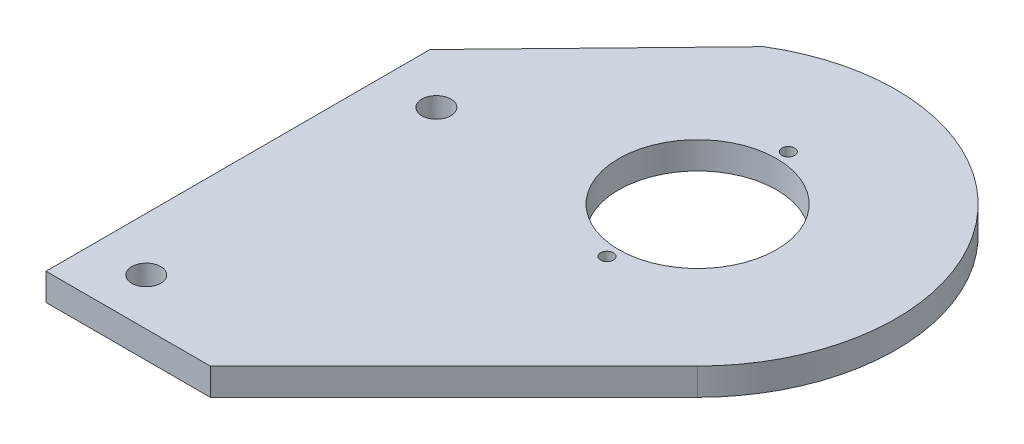
ISO-10303-21;
HEADER;
FILE_DESCRIPTION(('STEP AP214'),'2;1');
FILE_NAME('part.step','',(''),(''),'','','');
FILE_SCHEMA(('AUTOMOTIVE_DESIGN { 1 0 10303 214 1 1 1 1 }'));
ENDSEC;
DATA;
#1=APPLICATION_CONTEXT('core data for automotive mechanical design processes');
#2=APPLICATION_PROTOCOL_DEFINITION('international standard','automotive_design',2000,#1);
#3=PRODUCT_CONTEXT('',#1,'mechanical');
#4=PRODUCT('Part','Part','',(#3));
#5=PRODUCT_RELATED_PRODUCT_CATEGORY('part','',(#4));
#6=PRODUCT_DEFINITION_FORMATION('','',#4);
#7=PRODUCT_DEFINITION_CONTEXT('part definition',#1,'design');
#8=PRODUCT_DEFINITION('design','',#6,#7);
#9=PRODUCT_DEFINITION_SHAPE('','',#8);
#10=(LENGTH_UNIT() NAMED_UNIT(*) SI_UNIT(.MILLI.,.METRE.));
#11=(NAMED_UNIT(*) PLANE_ANGLE_UNIT() SI_UNIT($,.RADIAN.));
#12=(NAMED_UNIT(*) SI_UNIT($,.STERADIAN.) SOLID_ANGLE_UNIT());
#13=UNCERTAINTY_MEASURE_WITH_UNIT(LENGTH_MEASURE(1.E-05),#10,'distance_accuracy_value','');
#14=(GEOMETRIC_REPRESENTATION_CONTEXT(3) GLOBAL_UNCERTAINTY_ASSIGNED_CONTEXT((#13)) GLOBAL_UNIT_ASSIGNED_CONTEXT((#10,
#11,#12)) REPRESENTATION_CONTEXT('',''));
#15=CARTESIAN_POINT('',(0.,0.,0.));
#16=DIRECTION('',(0.,0.,1.));
#17=DIRECTION('',(1.,0.,0.));
#18=AXIS2_PLACEMENT_3D('',#15,#16,#17);
#19=CARTESIAN_POINT('',(0.,-6.35,0.));
#20=DIRECTION('',(-1.,0.,0.));
#21=DIRECTION('',(0.,0.,1.));
#22=AXIS2_PLACEMENT_3D('',#19,#20,#21);
#23=PLANE('',#22);
#24=DIRECTION('',(0.,0.,1.));
#25=VECTOR('',#24,1.);
#26=CARTESIAN_POINT('',(0.,0.,0.));
#27=LINE('',#26,#25);
#28=CARTESIAN_POINT('',(0.,0.,-90.));
#29=VERTEX_POINT('',#28);
#30=CARTESIAN_POINT('',(0.,0.,0.));
#31=VERTEX_POINT('',#30);
#32=EDGE_CURVE('E118',#29,#31,#27,.T.);
#33=ORIENTED_EDGE('',*,*,#32,.F.);
#34=DIRECTION('',(0.,1.,0.));
#35=VECTOR('',#34,1.);
#36=CARTESIAN_POINT('',(0.,-6.35,-90.));
#37=LINE('',#36,#35);
#38=CARTESIAN_POINT('',(0.,-6.35,-90.));
#39=VERTEX_POINT('',#38);
#40=EDGE_CURVE('E11',#39,#29,#37,.T.);
#41=ORIENTED_EDGE('',*,*,#40,.F.);
#42=DIRECTION('',(0.,0.,1.));
#43=VECTOR('',#42,1.);
#44=CARTESIAN_POINT('',(0.,-6.35,0.));
#45=LINE('',#44,#43);
#46=CARTESIAN_POINT('',(0.,-6.35,0.));
#47=VERTEX_POINT('',#46);
#48=EDGE_CURVE('E113',#39,#47,#45,.T.);
#49=ORIENTED_EDGE('',*,*,#48,.T.);
#50=DIRECTION('',(0.,1.,0.));
#51=VECTOR('',#50,1.);
#52=CARTESIAN_POINT('',(0.,-6.35,0.));
#53=LINE('',#52,#51);
#54=EDGE_CURVE('E44',#47,#31,#53,.T.);
#55=ORIENTED_EDGE('',*,*,#54,.T.);
#56=EDGE_LOOP('',(#33,#41,#49,#55));
#57=FACE_BOUND('',#56,.T.);
#58=ADVANCED_FACE('F41',(#57),#23,.T.);
#59=CARTESIAN_POINT('',(0.,-6.35,-90.));
#60=DIRECTION('',(-0.717622638837594,0.,-0.69643215622756));
#61=DIRECTION('',(-0.69643215622756,0.,0.717622638837594));
#62=AXIS2_PLACEMENT_3D('',#59,#60,#61);
#63=PLANE('',#62);
#64=DIRECTION('',(-0.69643215622756,0.,0.717622638837594));
#65=VECTOR('',#64,1.);
#66=CARTESIAN_POINT('',(0.,0.,-90.));
#67=LINE('',#66,#65);
#68=CARTESIAN_POINT('',(38.5109306503488,0.,-129.682710555893));
#69=VERTEX_POINT('',#68);
#70=EDGE_CURVE('E128',#69,#29,#67,.T.);
#71=ORIENTED_EDGE('',*,*,#70,.F.);
#72=DIRECTION('',(0.,1.,0.));
#73=VECTOR('',#72,1.);
#74=CARTESIAN_POINT('',(38.5109306503488,-6.35,-129.682710555893));
#75=LINE('',#74,#73);
#76=CARTESIAN_POINT('',(38.5109306503488,-6.35,-129.682710555893));
#77=VERTEX_POINT('',#76);
#78=EDGE_CURVE('E50',#77,#69,#75,.T.);
#79=ORIENTED_EDGE('',*,*,#78,.F.);
#80=DIRECTION('',(-0.69643215622756,0.,0.717622638837594));
#81=VECTOR('',#80,1.);
#82=CARTESIAN_POINT('',(0.,-6.35,-90.));
#83=LINE('',#82,#81);
#84=EDGE_CURVE('E108',#77,#39,#83,.T.);
#85=ORIENTED_EDGE('',*,*,#84,.T.);
#86=ORIENTED_EDGE('',*,*,#40,.T.);
#87=EDGE_LOOP('',(#71,#79,#85,#86));
#88=FACE_BOUND('',#87,.T.);
#89=ADVANCED_FACE('F134',(#88),#63,.T.);
#90=CARTESIAN_POINT('',(62.75,-6.35,-90.));
#91=DIRECTION('',(0.,1.,0.));
#92=DIRECTION('',(0.,0.,1.));
#93=AXIS2_PLACEMENT_3D('',#90,#91,#92);
#94=CYLINDRICAL_SURFACE('',#93,46.5);
#95=CARTESIAN_POINT('',(62.75,0.,-90.));
#96=DIRECTION('',(0.,1.,0.));
#97=DIRECTION('',(0.,0.,-1.));
#98=AXIS2_PLACEMENT_3D('',#95,#96,#97);
#99=CIRCLE('',#98,46.5);
#100=CARTESIAN_POINT('',(95.6304653251744,0.,-57.1195346748255));
#101=VERTEX_POINT('',#100);
#102=EDGE_CURVE('E97',#101,#69,#99,.T.);
#103=ORIENTED_EDGE('',*,*,#102,.F.);
#104=DIRECTION('',(0.,1.,0.));
#105=VECTOR('',#104,1.);
#106=CARTESIAN_POINT('',(95.6304653251744,-6.35,-57.1195346748255));
#107=LINE('',#106,#105);
#108=CARTESIAN_POINT('',(95.6304653251744,-6.35,-57.1195346748255));
#109=VERTEX_POINT('',#108);
#110=EDGE_CURVE('E92',#109,#101,#107,.T.);
#111=ORIENTED_EDGE('',*,*,#110,.F.);
#112=CARTESIAN_POINT('',(62.75,-6.35,-90.));
#113=DIRECTION('',(0.,1.,0.));
#114=DIRECTION('',(0.,0.,-1.));
#115=AXIS2_PLACEMENT_3D('',#112,#113,#114);
#116=CIRCLE('',#115,46.5);
#117=EDGE_CURVE('E95',#109,#77,#116,.T.);
#118=ORIENTED_EDGE('',*,*,#117,.T.);
#119=ORIENTED_EDGE('',*,*,#78,.T.);
#120=EDGE_LOOP('',(#103,#111,#118,#119));
#121=FACE_BOUND('',#120,.T.);
#122=ADVANCED_FACE('F94',(#121),#94,.T.);
#123=CARTESIAN_POINT('',(95.6304653251744,-6.35,-57.1195346748255));
#124=DIRECTION('',(0.707106781186547,0.,0.707106781186548));
#125=DIRECTION('',(0.707106781186548,0.,-0.707106781186547));
#126=AXIS2_PLACEMENT_3D('',#123,#124,#125);
#127=PLANE('',#126);
#128=DIRECTION('',(0.707106781186548,0.,-0.707106781186547));
#129=VECTOR('',#128,1.);
#130=CARTESIAN_POINT('',(95.6304653251744,0.,-57.1195346748255));
#131=LINE('',#130,#129);
#132=CARTESIAN_POINT('',(38.5109306503488,0.,0.));
#133=VERTEX_POINT('',#132);
#134=EDGE_CURVE('E125',#133,#101,#131,.T.);
#135=ORIENTED_EDGE('',*,*,#134,.F.);
#136=DIRECTION('',(0.,1.,0.));
#137=VECTOR('',#136,1.);
#138=CARTESIAN_POINT('',(38.5109306503488,-6.35,0.));
#139=LINE('',#138,#137);
#140=CARTESIAN_POINT('',(38.5109306503488,-6.35,0.));
#141=VERTEX_POINT('',#140);
#142=EDGE_CURVE('E102',#141,#133,#139,.T.);
#143=ORIENTED_EDGE('',*,*,#142,.F.);
#144=DIRECTION('',(0.707106781186548,0.,-0.707106781186547));
#145=VECTOR('',#144,1.);
#146=CARTESIAN_POINT('',(95.6304653251744,-6.35,-57.1195346748255));
#147=LINE('',#146,#145);
#148=EDGE_CURVE('E107',#141,#109,#147,.T.);
#149=ORIENTED_EDGE('',*,*,#148,.T.);
#150=ORIENTED_EDGE('',*,*,#110,.T.);
#151=EDGE_LOOP('',(#135,#143,#149,#150));
#152=FACE_BOUND('',#151,.T.);
#153=ADVANCED_FACE('F110',(#152),#127,.T.);
#154=CARTESIAN_POINT('',(0.,-6.35,0.));
#155=DIRECTION('',(0.,0.,1.));
#156=DIRECTION('',(1.,0.,0.));
#157=AXIS2_PLACEMENT_3D('',#154,#155,#156);
#158=PLANE('',#157);
#159=DIRECTION('',(1.,0.,0.));
#160=VECTOR('',#159,1.);
#161=CARTESIAN_POINT('',(0.,0.,0.));
#162=LINE('',#161,#160);
#163=EDGE_CURVE('E121',#31,#133,#162,.T.);
#164=ORIENTED_EDGE('',*,*,#163,.F.);
#165=ORIENTED_EDGE('',*,*,#54,.F.);
#166=DIRECTION('',(1.,0.,0.));
#167=VECTOR('',#166,1.);
#168=CARTESIAN_POINT('',(0.,-6.35,0.));
#169=LINE('',#168,#167);
#170=EDGE_CURVE('E111',#47,#141,#169,.T.);
#171=ORIENTED_EDGE('',*,*,#170,.T.);
#172=ORIENTED_EDGE('',*,*,#142,.T.);
#173=EDGE_LOOP('',(#164,#165,#171,#172));
#174=FACE_BOUND('',#173,.T.);
#175=ADVANCED_FACE('F131',(#174),#158,.T.);
#176=CARTESIAN_POINT('',(62.75,-6.35,-90.));
#177=DIRECTION('',(0.,-1.,0.));
#178=DIRECTION('',(0.,0.,-1.));
#179=AXIS2_PLACEMENT_3D('',#176,#177,#178);
#180=PLANE('',#179);
#181=CARTESIAN_POINT('',(62.75,-6.35,-111.25));
#182=DIRECTION('',(0.,1.,0.));
#183=DIRECTION('',(0.,0.,1.));
#184=AXIS2_PLACEMENT_3D('',#181,#182,#183);
#185=CIRCLE('',#184,1.5);
#186=CARTESIAN_POINT('',(62.75,-6.35,-109.75));
#187=VERTEX_POINT('',#186);
#188=EDGE_CURVE('E181',#187,#187,#185,.T.);
#189=ORIENTED_EDGE('',*,*,#188,.T.);
#190=EDGE_LOOP('',(#189));
#191=FACE_BOUND('',#190,.T.);
#192=CARTESIAN_POINT('',(62.75,-6.35,-68.75));
#193=DIRECTION('',(0.,1.,0.));
#194=DIRECTION('',(0.,0.,1.));
#195=AXIS2_PLACEMENT_3D('',#192,#193,#194);
#196=CIRCLE('',#195,1.5);
#197=CARTESIAN_POINT('',(62.75,-6.35,-67.25));
#198=VERTEX_POINT('',#197);
#199=EDGE_CURVE('E190',#198,#198,#196,.T.);
#200=ORIENTED_EDGE('',*,*,#199,.T.);
#201=EDGE_LOOP('',(#200));
#202=FACE_BOUND('',#201,.T.);
#203=CARTESIAN_POINT('',(62.75,-6.35,-90.));
#204=DIRECTION('',(0.,1.,0.));
#205=DIRECTION('',(0.,0.,1.));
#206=AXIS2_PLACEMENT_3D('',#203,#204,#205);
#207=CIRCLE('',#206,18.5);
#208=CARTESIAN_POINT('',(62.75,-6.35,-71.5));
#209=VERTEX_POINT('',#208);
#210=EDGE_CURVE('E195',#209,#209,#207,.T.);
#211=ORIENTED_EDGE('',*,*,#210,.T.);
#212=EDGE_LOOP('',(#211));
#213=FACE_BOUND('',#212,.T.);
#214=CARTESIAN_POINT('',(12.5,-6.35,-79.));
#215=DIRECTION('',(0.,1.,0.));
#216=DIRECTION('',(0.,0.,1.));
#217=AXIS2_PLACEMENT_3D('',#214,#215,#216);
#218=CIRCLE('',#217,3.4);
#219=CARTESIAN_POINT('',(12.5,-6.35,-75.6));
#220=VERTEX_POINT('',#219);
#221=EDGE_CURVE('E122',#220,#220,#218,.T.);
#222=ORIENTED_EDGE('',*,*,#221,.T.);
#223=EDGE_LOOP('',(#222));
#224=FACE_BOUND('',#223,.T.);
#225=CARTESIAN_POINT('',(12.5,-6.35,-11.));
#226=DIRECTION('',(0.,1.,0.));
#227=DIRECTION('',(0.,0.,-1.));
#228=AXIS2_PLACEMENT_3D('',#225,#226,#227);
#229=CIRCLE('',#228,3.4);
#230=CARTESIAN_POINT('',(12.5,-6.35,-14.4));
#231=VERTEX_POINT('',#230);
#232=EDGE_CURVE('E198',#231,#231,#229,.T.);
#233=ORIENTED_EDGE('',*,*,#232,.T.);
#234=EDGE_LOOP('',(#233));
#235=FACE_BOUND('',#234,.T.);
#236=ORIENTED_EDGE('',*,*,#48,.F.);
#237=ORIENTED_EDGE('',*,*,#84,.F.);
#238=ORIENTED_EDGE('',*,*,#117,.F.);
#239=ORIENTED_EDGE('',*,*,#148,.F.);
#240=ORIENTED_EDGE('',*,*,#170,.F.);
#241=EDGE_LOOP('',(#236,#237,#238,#239,#240));
#242=FACE_BOUND('',#241,.T.);
#243=ADVANCED_FACE('F106',(#191,#202,#213,#224,#235,#242),#180,.T.);
#244=CARTESIAN_POINT('',(62.75,0.,-90.));
#245=DIRECTION('',(0.,-1.,0.));
#246=DIRECTION('',(0.,0.,-1.));
#247=AXIS2_PLACEMENT_3D('',#244,#245,#246);
#248=PLANE('',#247);
#249=CARTESIAN_POINT('',(62.75,0.,-111.25));
#250=DIRECTION('',(0.,1.,0.));
#251=DIRECTION('',(0.,0.,1.));
#252=AXIS2_PLACEMENT_3D('',#249,#250,#251);
#253=CIRCLE('',#252,1.5);
#254=CARTESIAN_POINT('',(62.75,0.,-109.75));
#255=VERTEX_POINT('',#254);
#256=EDGE_CURVE('E184',#255,#255,#253,.T.);
#257=ORIENTED_EDGE('',*,*,#256,.F.);
#258=EDGE_LOOP('',(#257));
#259=FACE_BOUND('',#258,.T.);
#260=CARTESIAN_POINT('',(62.75,0.,-68.75));
#261=DIRECTION('',(0.,1.,0.));
#262=DIRECTION('',(0.,0.,1.));
#263=AXIS2_PLACEMENT_3D('',#260,#261,#262);
#264=CIRCLE('',#263,1.5);
#265=CARTESIAN_POINT('',(62.75,0.,-67.25));
#266=VERTEX_POINT('',#265);
#267=EDGE_CURVE('E185',#266,#266,#264,.T.);
#268=ORIENTED_EDGE('',*,*,#267,.F.);
#269=EDGE_LOOP('',(#268));
#270=FACE_BOUND('',#269,.T.);
#271=CARTESIAN_POINT('',(62.75,0.,-90.));
#272=DIRECTION('',(0.,1.,0.));
#273=DIRECTION('',(0.,0.,1.));
#274=AXIS2_PLACEMENT_3D('',#271,#272,#273);
#275=CIRCLE('',#274,18.5);
#276=CARTESIAN_POINT('',(62.75,0.,-71.5));
#277=VERTEX_POINT('',#276);
#278=EDGE_CURVE('E187',#277,#277,#275,.T.);
#279=ORIENTED_EDGE('',*,*,#278,.F.);
#280=EDGE_LOOP('',(#279));
#281=FACE_BOUND('',#280,.T.);
#282=CARTESIAN_POINT('',(12.5,0.,-79.));
#283=DIRECTION('',(0.,1.,0.));
#284=DIRECTION('',(0.,0.,1.));
#285=AXIS2_PLACEMENT_3D('',#282,#283,#284);
#286=CIRCLE('',#285,3.4);
#287=CARTESIAN_POINT('',(12.5,0.,-75.6));
#288=VERTEX_POINT('',#287);
#289=EDGE_CURVE('E203',#288,#288,#286,.T.);
#290=ORIENTED_EDGE('',*,*,#289,.F.);
#291=EDGE_LOOP('',(#290));
#292=FACE_BOUND('',#291,.T.);
#293=CARTESIAN_POINT('',(12.5,0.,-11.));
#294=DIRECTION('',(0.,1.,0.));
#295=DIRECTION('',(0.,0.,-1.));
#296=AXIS2_PLACEMENT_3D('',#293,#294,#295);
#297=CIRCLE('',#296,3.4);
#298=CARTESIAN_POINT('',(12.5,0.,-14.4));
#299=VERTEX_POINT('',#298);
#300=EDGE_CURVE('E206',#299,#299,#297,.T.);
#301=ORIENTED_EDGE('',*,*,#300,.F.);
#302=EDGE_LOOP('',(#301));
#303=FACE_BOUND('',#302,.T.);
#304=ORIENTED_EDGE('',*,*,#32,.T.);
#305=ORIENTED_EDGE('',*,*,#163,.T.);
#306=ORIENTED_EDGE('',*,*,#134,.T.);
#307=ORIENTED_EDGE('',*,*,#102,.T.);
#308=ORIENTED_EDGE('',*,*,#70,.T.);
#309=EDGE_LOOP('',(#304,#305,#306,#307,#308));
#310=FACE_BOUND('',#309,.T.);
#311=ADVANCED_FACE('F133',(#259,#270,#281,#292,#303,#310),#248,.F.);
#312=CARTESIAN_POINT('',(12.5,-6.35,-11.));
#313=DIRECTION('',(0.,1.,0.));
#314=DIRECTION('',(0.,0.,1.));
#315=AXIS2_PLACEMENT_3D('',#312,#313,#314);
#316=CYLINDRICAL_SURFACE('',#315,3.4);
#317=ORIENTED_EDGE('',*,*,#232,.F.);
#318=EDGE_LOOP('',(#317));
#319=FACE_BOUND('',#318,.T.);
#320=ORIENTED_EDGE('',*,*,#300,.T.);
#321=EDGE_LOOP('',(#320));
#322=FACE_BOUND('',#321,.T.);
#323=ADVANCED_FACE('F154',(#319,#322),#316,.F.);
#324=CARTESIAN_POINT('',(12.5,-6.35,-79.));
#325=DIRECTION('',(0.,1.,0.));
#326=DIRECTION('',(0.,0.,1.));
#327=AXIS2_PLACEMENT_3D('',#324,#325,#326);
#328=CYLINDRICAL_SURFACE('',#327,3.4);
#329=ORIENTED_EDGE('',*,*,#221,.F.);
#330=EDGE_LOOP('',(#329));
#331=FACE_BOUND('',#330,.T.);
#332=ORIENTED_EDGE('',*,*,#289,.T.);
#333=EDGE_LOOP('',(#332));
#334=FACE_BOUND('',#333,.T.);
#335=ADVANCED_FACE('F161',(#331,#334),#328,.F.);
#336=CARTESIAN_POINT('',(62.75,-6.35,-90.));
#337=DIRECTION('',(0.,1.,0.));
#338=DIRECTION('',(0.,0.,1.));
#339=AXIS2_PLACEMENT_3D('',#336,#337,#338);
#340=CYLINDRICAL_SURFACE('',#339,18.5);
#341=ORIENTED_EDGE('',*,*,#210,.F.);
#342=EDGE_LOOP('',(#341));
#343=FACE_BOUND('',#342,.T.);
#344=ORIENTED_EDGE('',*,*,#278,.T.);
#345=EDGE_LOOP('',(#344));
#346=FACE_BOUND('',#345,.T.);
#347=ADVANCED_FACE('F165',(#343,#346),#340,.F.);
#348=CARTESIAN_POINT('',(62.75,-6.35,-68.75));
#349=DIRECTION('',(0.,1.,0.));
#350=DIRECTION('',(0.,0.,1.));
#351=AXIS2_PLACEMENT_3D('',#348,#349,#350);
#352=CYLINDRICAL_SURFACE('',#351,1.5);
#353=ORIENTED_EDGE('',*,*,#199,.F.);
#354=EDGE_LOOP('',(#353));
#355=FACE_BOUND('',#354,.T.);
#356=ORIENTED_EDGE('',*,*,#267,.T.);
#357=EDGE_LOOP('',(#356));
#358=FACE_BOUND('',#357,.T.);
#359=ADVANCED_FACE('F169',(#355,#358),#352,.F.);
#360=CARTESIAN_POINT('',(62.75,-6.35,-111.25));
#361=DIRECTION('',(0.,1.,0.));
#362=DIRECTION('',(0.,0.,1.));
#363=AXIS2_PLACEMENT_3D('',#360,#361,#362);
#364=CYLINDRICAL_SURFACE('',#363,1.5);
#365=ORIENTED_EDGE('',*,*,#188,.F.);
#366=EDGE_LOOP('',(#365));
#367=FACE_BOUND('',#366,.T.);
#368=ORIENTED_EDGE('',*,*,#256,.T.);
#369=EDGE_LOOP('',(#368));
#370=FACE_BOUND('',#369,.T.);
#371=ADVANCED_FACE('F173',(#367,#370),#364,.F.);
#372=CLOSED_SHELL('',(#58,#89,#122,#153,#175,#243,#311,#323,#335,#347,#359,#371));
#373=MANIFOLD_SOLID_BREP('B2',#372);
#374=ADVANCED_BREP_SHAPE_REPRESENTATION('',(#18,#373),#14);
#375=SHAPE_DEFINITION_REPRESENTATION(#9,#374);
ENDSEC;
END-ISO-10303-21;
